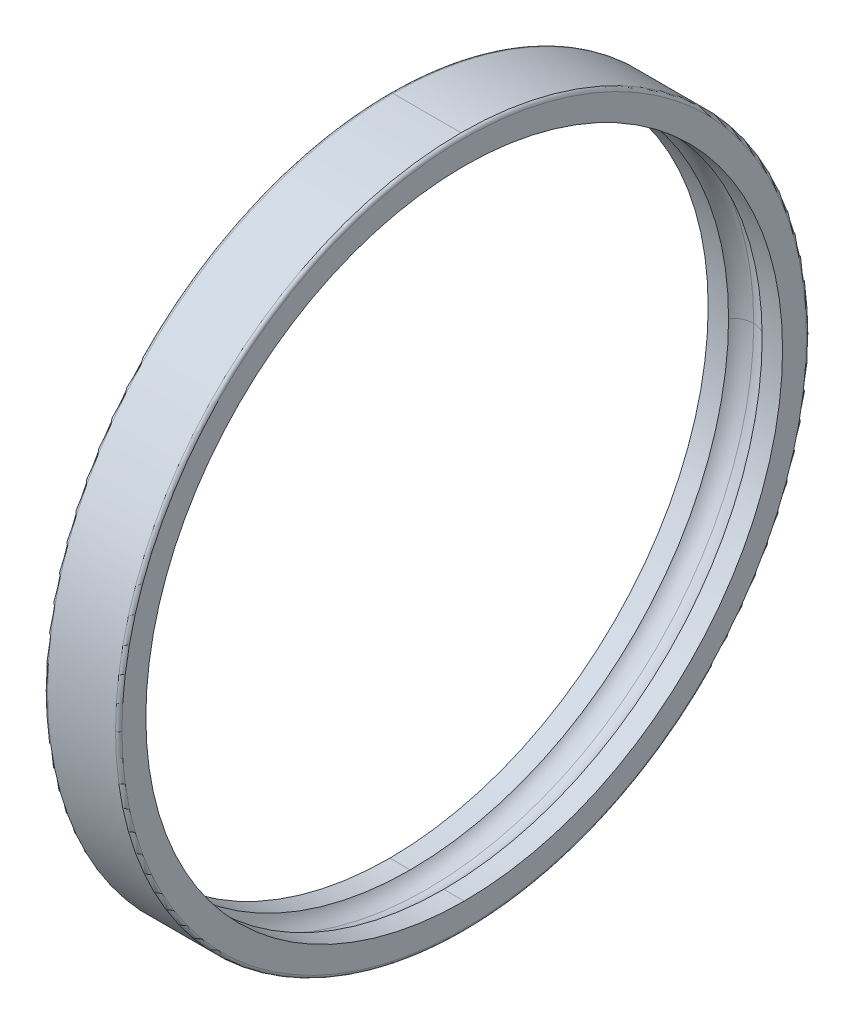
ISO-10303-21;
HEADER;
FILE_DESCRIPTION(('STEP AP214'),'2;1');
FILE_NAME('part.step','',(''),(''),'','','');
FILE_SCHEMA(('AUTOMOTIVE_DESIGN { 1 0 10303 214 1 1 1 1 }'));
ENDSEC;
DATA;
#1=APPLICATION_CONTEXT('core data for automotive mechanical design processes');
#2=APPLICATION_PROTOCOL_DEFINITION('international standard','automotive_design',2000,#1);
#3=PRODUCT_CONTEXT('',#1,'mechanical');
#4=PRODUCT('Part','Part','',(#3));
#5=PRODUCT_RELATED_PRODUCT_CATEGORY('part','',(#4));
#6=PRODUCT_DEFINITION_FORMATION('','',#4);
#7=PRODUCT_DEFINITION_CONTEXT('part definition',#1,'design');
#8=PRODUCT_DEFINITION('design','',#6,#7);
#9=PRODUCT_DEFINITION_SHAPE('','',#8);
#10=(LENGTH_UNIT() NAMED_UNIT(*) SI_UNIT(.MILLI.,.METRE.));
#11=(NAMED_UNIT(*) PLANE_ANGLE_UNIT() SI_UNIT($,.RADIAN.));
#12=(NAMED_UNIT(*) SI_UNIT($,.STERADIAN.) SOLID_ANGLE_UNIT());
#13=UNCERTAINTY_MEASURE_WITH_UNIT(LENGTH_MEASURE(1.E-05),#10,'distance_accuracy_value','');
#14=(GEOMETRIC_REPRESENTATION_CONTEXT(3) GLOBAL_UNCERTAINTY_ASSIGNED_CONTEXT((#13)) GLOBAL_UNIT_ASSIGNED_CONTEXT((#10,
#11,#12)) REPRESENTATION_CONTEXT('',''));
#15=CARTESIAN_POINT('',(0.,0.,0.));
#16=DIRECTION('',(0.,0.,1.));
#17=DIRECTION('',(1.,0.,0.));
#18=AXIS2_PLACEMENT_3D('',#15,#16,#17);
#19=CARTESIAN_POINT('',(6.04029112515579,0.,0.));
#20=DIRECTION('',(1.,0.,0.));
#21=DIRECTION('',(0.,1.,0.));
#22=AXIS2_PLACEMENT_3D('',#19,#20,#21);
#23=CYLINDRICAL_SURFACE('',#22,29.95);
#24=DIRECTION('',(1.,0.,0.));
#25=VECTOR('',#24,1.);
#26=CARTESIAN_POINT('',(6.04029112515579,29.95,0.));
#27=LINE('',#26,#25);
#28=CARTESIAN_POINT('',(5.08058225031159,29.95,0.));
#29=VERTEX_POINT('',#28);
#30=CARTESIAN_POINT('',(7.,29.95,0.));
#31=VERTEX_POINT('',#30);
#32=EDGE_CURVE('E156',#29,#31,#27,.T.);
#33=ORIENTED_EDGE('',*,*,#32,.T.);
#34=CARTESIAN_POINT('',(7.,0.,0.));
#35=DIRECTION('',(1.,0.,0.));
#36=DIRECTION('',(0.,1.,0.));
#37=AXIS2_PLACEMENT_3D('',#34,#35,#36);
#38=CIRCLE('',#37,29.95);
#39=CARTESIAN_POINT('',(7.,-29.95,0.));
#40=VERTEX_POINT('',#39);
#41=EDGE_CURVE('E11',#31,#40,#38,.T.);
#42=ORIENTED_EDGE('',*,*,#41,.T.);
#43=DIRECTION('',(-1.,0.,0.));
#44=VECTOR('',#43,1.);
#45=CARTESIAN_POINT('',(6.04029112515579,-29.95,0.));
#46=LINE('',#45,#44);
#47=CARTESIAN_POINT('',(5.08058225031159,-29.95,0.));
#48=VERTEX_POINT('',#47);
#49=EDGE_CURVE('E150',#40,#48,#46,.T.);
#50=ORIENTED_EDGE('',*,*,#49,.T.);
#51=CARTESIAN_POINT('',(5.08058225031159,0.,0.));
#52=DIRECTION('',(1.,0.,0.));
#53=DIRECTION('',(0.,1.,0.));
#54=AXIS2_PLACEMENT_3D('',#51,#52,#53);
#55=CIRCLE('',#54,29.95);
#56=CARTESIAN_POINT('',(5.08058225031159,0.,29.95));
#57=VERTEX_POINT('',#56);
#58=EDGE_CURVE('E154',#57,#48,#55,.T.);
#59=ORIENTED_EDGE('',*,*,#58,.F.);
#60=CARTESIAN_POINT('',(5.08058225031159,0.,0.));
#61=DIRECTION('',(1.,0.,0.));
#62=DIRECTION('',(0.,1.,0.));
#63=AXIS2_PLACEMENT_3D('',#60,#61,#62);
#64=CIRCLE('',#63,29.95);
#65=EDGE_CURVE('E215',#29,#57,#64,.T.);
#66=ORIENTED_EDGE('',*,*,#65,.F.);
#67=EDGE_LOOP('',(#33,#42,#50,#59,#66));
#68=FACE_BOUND('',#67,.T.);
#69=ADVANCED_FACE('F17',(#68),#23,.F.);
#70=CARTESIAN_POINT('',(7.,31.075,0.));
#71=DIRECTION('',(1.,0.,0.));
#72=DIRECTION('',(0.,-1.,0.));
#73=AXIS2_PLACEMENT_3D('',#70,#71,#72);
#74=PLANE('',#73);
#75=ORIENTED_EDGE('',*,*,#41,.F.);
#76=CARTESIAN_POINT('',(7.,0.,0.));
#77=DIRECTION('',(1.,0.,0.));
#78=DIRECTION('',(0.,1.,0.));
#79=AXIS2_PLACEMENT_3D('',#76,#77,#78);
#80=CIRCLE('',#79,29.95);
#81=EDGE_CURVE('E160',#40,#31,#80,.T.);
#82=ORIENTED_EDGE('',*,*,#81,.F.);
#83=EDGE_LOOP('',(#75,#82));
#84=FACE_BOUND('',#83,.T.);
#85=CARTESIAN_POINT('',(7.,0.,0.));
#86=DIRECTION('',(1.,0.,0.));
#87=DIRECTION('',(0.,1.,0.));
#88=AXIS2_PLACEMENT_3D('',#85,#86,#87);
#89=CIRCLE('',#88,32.2);
#90=CARTESIAN_POINT('',(7.,0.,32.2));
#91=VERTEX_POINT('',#90);
#92=CARTESIAN_POINT('',(7.,0.,-32.2));
#93=VERTEX_POINT('',#92);
#94=EDGE_CURVE('E27',#91,#93,#89,.T.);
#95=ORIENTED_EDGE('',*,*,#94,.T.);
#96=CARTESIAN_POINT('',(7.,0.,0.));
#97=DIRECTION('',(1.,0.,0.));
#98=DIRECTION('',(0.,1.,0.));
#99=AXIS2_PLACEMENT_3D('',#96,#97,#98);
#100=CIRCLE('',#99,32.2);
#101=EDGE_CURVE('E176',#93,#91,#100,.T.);
#102=ORIENTED_EDGE('',*,*,#101,.T.);
#103=EDGE_LOOP('',(#95,#102));
#104=FACE_BOUND('',#103,.T.);
#105=ADVANCED_FACE('F19',(#84,#104),#74,.T.);
#106=CARTESIAN_POINT('',(6.7,0.,0.));
#107=DIRECTION('',(1.,0.,0.));
#108=DIRECTION('',(0.,0.,-1.));
#109=AXIS2_PLACEMENT_3D('',#106,#107,#108);
#110=TOROIDAL_SURFACE('',#109,32.2,0.3);
#111=CARTESIAN_POINT('',(6.7,0.,-32.2));
#112=DIRECTION('',(0.,-1.,0.));
#113=DIRECTION('',(0.,0.,-1.));
#114=AXIS2_PLACEMENT_3D('',#111,#112,#113);
#115=CIRCLE('',#114,0.3);
#116=CARTESIAN_POINT('',(6.7,0.,-32.5));
#117=VERTEX_POINT('',#116);
#118=EDGE_CURVE('E163',#117,#93,#115,.T.);
#119=ORIENTED_EDGE('',*,*,#118,.T.);
#120=ORIENTED_EDGE('',*,*,#94,.F.);
#121=CARTESIAN_POINT('',(6.7,0.,32.2));
#122=DIRECTION('',(0.,-1.,0.));
#123=DIRECTION('',(0.,0.,1.));
#124=AXIS2_PLACEMENT_3D('',#121,#122,#123);
#125=CIRCLE('',#124,0.3);
#126=CARTESIAN_POINT('',(6.7,0.,32.5));
#127=VERTEX_POINT('',#126);
#128=EDGE_CURVE('E172',#91,#127,#125,.T.);
#129=ORIENTED_EDGE('',*,*,#128,.T.);
#130=CARTESIAN_POINT('',(6.7,0.,0.));
#131=DIRECTION('',(1.,0.,0.));
#132=DIRECTION('',(0.,1.,0.));
#133=AXIS2_PLACEMENT_3D('',#130,#131,#132);
#134=CIRCLE('',#133,32.5);
#135=CARTESIAN_POINT('',(6.7,-32.5,0.));
#136=VERTEX_POINT('',#135);
#137=EDGE_CURVE('E184',#127,#136,#134,.T.);
#138=ORIENTED_EDGE('',*,*,#137,.T.);
#139=CARTESIAN_POINT('',(6.7,0.,0.));
#140=DIRECTION('',(1.,0.,0.));
#141=DIRECTION('',(0.,1.,0.));
#142=AXIS2_PLACEMENT_3D('',#139,#140,#141);
#143=CIRCLE('',#142,32.5);
#144=EDGE_CURVE('E21',#136,#117,#143,.T.);
#145=ORIENTED_EDGE('',*,*,#144,.T.);
#146=EDGE_LOOP('',(#119,#120,#129,#138,#145));
#147=FACE_BOUND('',#146,.T.);
#148=ADVANCED_FACE('F232',(#147),#110,.T.);
#149=CARTESIAN_POINT('',(3.5,0.,0.));
#150=DIRECTION('',(1.,0.,0.));
#151=DIRECTION('',(0.,1.,0.));
#152=AXIS2_PLACEMENT_3D('',#149,#150,#151);
#153=CYLINDRICAL_SURFACE('',#152,32.5);
#154=DIRECTION('',(1.,0.,0.));
#155=VECTOR('',#154,1.);
#156=CARTESIAN_POINT('',(3.5,32.5,0.));
#157=LINE('',#156,#155);
#158=CARTESIAN_POINT('',(0.3,32.5,0.));
#159=VERTEX_POINT('',#158);
#160=CARTESIAN_POINT('',(6.7,32.5,0.));
#161=VERTEX_POINT('',#160);
#162=EDGE_CURVE('E173',#159,#161,#157,.T.);
#163=ORIENTED_EDGE('',*,*,#162,.T.);
#164=CARTESIAN_POINT('',(6.7,0.,0.));
#165=DIRECTION('',(1.,0.,0.));
#166=DIRECTION('',(0.,1.,0.));
#167=AXIS2_PLACEMENT_3D('',#164,#165,#166);
#168=CIRCLE('',#167,32.5);
#169=EDGE_CURVE('E165',#117,#161,#168,.T.);
#170=ORIENTED_EDGE('',*,*,#169,.F.);
#171=ORIENTED_EDGE('',*,*,#144,.F.);
#172=DIRECTION('',(-1.,0.,0.));
#173=VECTOR('',#172,1.);
#174=CARTESIAN_POINT('',(3.5,-32.5,0.));
#175=LINE('',#174,#173);
#176=CARTESIAN_POINT('',(0.3,-32.5,0.));
#177=VERTEX_POINT('',#176);
#178=EDGE_CURVE('E182',#136,#177,#175,.T.);
#179=ORIENTED_EDGE('',*,*,#178,.T.);
#180=CARTESIAN_POINT('',(0.3,0.,0.));
#181=DIRECTION('',(1.,0.,0.));
#182=DIRECTION('',(0.,1.,0.));
#183=AXIS2_PLACEMENT_3D('',#180,#181,#182);
#184=CIRCLE('',#183,32.5);
#185=CARTESIAN_POINT('',(0.3,0.,-32.5));
#186=VERTEX_POINT('',#185);
#187=EDGE_CURVE('E139',#177,#186,#184,.T.);
#188=ORIENTED_EDGE('',*,*,#187,.T.);
#189=CARTESIAN_POINT('',(0.3,0.,0.));
#190=DIRECTION('',(1.,0.,0.));
#191=DIRECTION('',(0.,1.,0.));
#192=AXIS2_PLACEMENT_3D('',#189,#190,#191);
#193=CIRCLE('',#192,32.5);
#194=EDGE_CURVE('E194',#186,#159,#193,.T.);
#195=ORIENTED_EDGE('',*,*,#194,.T.);
#196=EDGE_LOOP('',(#163,#170,#171,#179,#188,#195));
#197=FACE_BOUND('',#196,.T.);
#198=ADVANCED_FACE('F235',(#197),#153,.T.);
#199=CARTESIAN_POINT('',(0.3,0.,0.));
#200=DIRECTION('',(1.,0.,0.));
#201=DIRECTION('',(0.,0.,-1.));
#202=AXIS2_PLACEMENT_3D('',#199,#200,#201);
#203=TOROIDAL_SURFACE('',#202,32.2,0.3);
#204=CARTESIAN_POINT('',(0.3,0.,-32.2));
#205=DIRECTION('',(0.,-1.,0.));
#206=DIRECTION('',(0.,0.,-1.));
#207=AXIS2_PLACEMENT_3D('',#204,#205,#206);
#208=CIRCLE('',#207,0.3);
#209=CARTESIAN_POINT('',(0.,0.,-32.2));
#210=VERTEX_POINT('',#209);
#211=EDGE_CURVE('E187',#210,#186,#208,.T.);
#212=ORIENTED_EDGE('',*,*,#211,.T.);
#213=ORIENTED_EDGE('',*,*,#187,.F.);
#214=CARTESIAN_POINT('',(0.3,0.,0.));
#215=DIRECTION('',(1.,0.,0.));
#216=DIRECTION('',(0.,1.,0.));
#217=AXIS2_PLACEMENT_3D('',#214,#215,#216);
#218=CIRCLE('',#217,32.5);
#219=CARTESIAN_POINT('',(0.3,0.,32.5));
#220=VERTEX_POINT('',#219);
#221=EDGE_CURVE('E179',#220,#177,#218,.T.);
#222=ORIENTED_EDGE('',*,*,#221,.F.);
#223=CARTESIAN_POINT('',(0.3,0.,32.2));
#224=DIRECTION('',(0.,-1.,0.));
#225=DIRECTION('',(0.,0.,1.));
#226=AXIS2_PLACEMENT_3D('',#223,#224,#225);
#227=CIRCLE('',#226,0.3);
#228=CARTESIAN_POINT('',(0.,0.,32.2));
#229=VERTEX_POINT('',#228);
#230=EDGE_CURVE('E192',#220,#229,#227,.T.);
#231=ORIENTED_EDGE('',*,*,#230,.T.);
#232=CARTESIAN_POINT('',(0.,0.,0.));
#233=DIRECTION('',(1.,0.,0.));
#234=DIRECTION('',(0.,1.,0.));
#235=AXIS2_PLACEMENT_3D('',#232,#233,#234);
#236=CIRCLE('',#235,32.2);
#237=EDGE_CURVE('E138',#229,#210,#236,.T.);
#238=ORIENTED_EDGE('',*,*,#237,.T.);
#239=EDGE_LOOP('',(#212,#213,#222,#231,#238));
#240=FACE_BOUND('',#239,.T.);
#241=ADVANCED_FACE('F267',(#240),#203,.T.);
#242=CARTESIAN_POINT('',(0.,31.075,0.));
#243=DIRECTION('',(-1.,0.,0.));
#244=DIRECTION('',(0.,1.,0.));
#245=AXIS2_PLACEMENT_3D('',#242,#243,#244);
#246=PLANE('',#245);
#247=CARTESIAN_POINT('',(0.,0.,0.));
#248=DIRECTION('',(1.,0.,0.));
#249=DIRECTION('',(0.,1.,0.));
#250=AXIS2_PLACEMENT_3D('',#247,#248,#249);
#251=CIRCLE('',#250,29.95);
#252=CARTESIAN_POINT('',(0.,29.95,0.));
#253=VERTEX_POINT('',#252);
#254=CARTESIAN_POINT('',(0.,-29.95,0.));
#255=VERTEX_POINT('',#254);
#256=EDGE_CURVE('E137',#253,#255,#251,.T.);
#257=ORIENTED_EDGE('',*,*,#256,.T.);
#258=CARTESIAN_POINT('',(0.,0.,0.));
#259=DIRECTION('',(1.,0.,0.));
#260=DIRECTION('',(0.,1.,0.));
#261=AXIS2_PLACEMENT_3D('',#258,#259,#260);
#262=CIRCLE('',#261,29.95);
#263=EDGE_CURVE('E127',#255,#253,#262,.T.);
#264=ORIENTED_EDGE('',*,*,#263,.T.);
#265=EDGE_LOOP('',(#257,#264));
#266=FACE_BOUND('',#265,.T.);
#267=CARTESIAN_POINT('',(0.,0.,0.));
#268=DIRECTION('',(1.,0.,0.));
#269=DIRECTION('',(0.,1.,0.));
#270=AXIS2_PLACEMENT_3D('',#267,#268,#269);
#271=CIRCLE('',#270,32.2);
#272=EDGE_CURVE('E189',#210,#229,#271,.T.);
#273=ORIENTED_EDGE('',*,*,#272,.F.);
#274=ORIENTED_EDGE('',*,*,#237,.F.);
#275=EDGE_LOOP('',(#273,#274));
#276=FACE_BOUND('',#275,.T.);
#277=ADVANCED_FACE('F269',(#266,#276),#246,.T.);
#278=CARTESIAN_POINT('',(0.95970887484421,0.,0.));
#279=DIRECTION('',(1.,0.,0.));
#280=DIRECTION('',(0.,1.,0.));
#281=AXIS2_PLACEMENT_3D('',#278,#279,#280);
#282=CYLINDRICAL_SURFACE('',#281,29.95);
#283=DIRECTION('',(1.,0.,0.));
#284=VECTOR('',#283,1.);
#285=CARTESIAN_POINT('',(0.95970887484421,29.95,0.));
#286=LINE('',#285,#284);
#287=CARTESIAN_POINT('',(1.91941774968842,29.95,0.));
#288=VERTEX_POINT('',#287);
#289=EDGE_CURVE('E129',#253,#288,#286,.T.);
#290=ORIENTED_EDGE('',*,*,#289,.T.);
#291=CARTESIAN_POINT('',(1.91941774968842,0.,0.));
#292=DIRECTION('',(1.,0.,0.));
#293=DIRECTION('',(0.,1.,0.));
#294=AXIS2_PLACEMENT_3D('',#291,#292,#293);
#295=CIRCLE('',#294,29.95);
#296=CARTESIAN_POINT('',(1.91941774968842,0.,29.95));
#297=VERTEX_POINT('',#296);
#298=EDGE_CURVE('E35',#288,#297,#295,.T.);
#299=ORIENTED_EDGE('',*,*,#298,.T.);
#300=CARTESIAN_POINT('',(1.91941774968842,0.,0.));
#301=DIRECTION('',(1.,0.,0.));
#302=DIRECTION('',(0.,1.,0.));
#303=AXIS2_PLACEMENT_3D('',#300,#301,#302);
#304=CIRCLE('',#303,29.95);
#305=CARTESIAN_POINT('',(1.91941774968842,-29.95,0.));
#306=VERTEX_POINT('',#305);
#307=EDGE_CURVE('E103',#297,#306,#304,.T.);
#308=ORIENTED_EDGE('',*,*,#307,.T.);
#309=DIRECTION('',(-1.,0.,0.));
#310=VECTOR('',#309,1.);
#311=CARTESIAN_POINT('',(0.95970887484421,-29.95,0.));
#312=LINE('',#311,#310);
#313=EDGE_CURVE('E107',#306,#255,#312,.T.);
#314=ORIENTED_EDGE('',*,*,#313,.T.);
#315=ORIENTED_EDGE('',*,*,#256,.F.);
#316=EDGE_LOOP('',(#290,#299,#308,#314,#315));
#317=FACE_BOUND('',#316,.T.);
#318=ADVANCED_FACE('F105',(#317),#282,.F.);
#319=CARTESIAN_POINT('',(3.5,0.,0.));
#320=DIRECTION('',(1.,0.,0.));
#321=DIRECTION('',(0.,0.,-1.));
#322=AXIS2_PLACEMENT_3D('',#319,#320,#321);
#323=TOROIDAL_SURFACE('',#322,28.75,1.9845);
#324=CARTESIAN_POINT('',(3.5,0.,0.));
#325=DIRECTION('',(1.,0.,0.));
#326=DIRECTION('',(0.,0.,1.));
#327=AXIS2_PLACEMENT_3D('',#324,#325,#326);
#328=CIRCLE('',#327,30.7345);
#329=CARTESIAN_POINT('',(3.5,0.,-30.7345));
#330=VERTEX_POINT('',#329);
#331=CARTESIAN_POINT('',(3.5,0.,30.7345));
#332=VERTEX_POINT('',#331);
#333=EDGE_CURVE('E200',#330,#332,#328,.T.);
#334=ORIENTED_EDGE('',*,*,#333,.T.);
#335=CARTESIAN_POINT('',(3.5,0.,28.75));
#336=DIRECTION('',(0.,-1.,0.));
#337=DIRECTION('',(0.,0.,1.));
#338=AXIS2_PLACEMENT_3D('',#335,#336,#337);
#339=CIRCLE('',#338,1.9845);
#340=EDGE_CURVE('E111',#332,#297,#339,.T.);
#341=ORIENTED_EDGE('',*,*,#340,.T.);
#342=ORIENTED_EDGE('',*,*,#298,.F.);
#343=CARTESIAN_POINT('',(1.91941774968842,0.,0.));
#344=DIRECTION('',(1.,0.,0.));
#345=DIRECTION('',(0.,1.,0.));
#346=AXIS2_PLACEMENT_3D('',#343,#344,#345);
#347=CIRCLE('',#346,29.95);
#348=CARTESIAN_POINT('',(1.91941774968842,0.,-29.95));
#349=VERTEX_POINT('',#348);
#350=EDGE_CURVE('E122',#349,#288,#347,.T.);
#351=ORIENTED_EDGE('',*,*,#350,.F.);
#352=CARTESIAN_POINT('',(3.5,0.,-28.75));
#353=DIRECTION('',(0.,-1.,0.));
#354=DIRECTION('',(0.,0.,-1.));
#355=AXIS2_PLACEMENT_3D('',#352,#353,#354);
#356=CIRCLE('',#355,1.9845);
#357=EDGE_CURVE('E112',#349,#330,#356,.T.);
#358=ORIENTED_EDGE('',*,*,#357,.T.);
#359=EDGE_LOOP('',(#334,#341,#342,#351,#358));
#360=FACE_BOUND('',#359,.T.);
#361=ADVANCED_FACE('F197',(#360),#323,.F.);
#362=CARTESIAN_POINT('',(3.5,0.,0.));
#363=DIRECTION('',(1.,0.,0.));
#364=DIRECTION('',(0.,0.,-1.));
#365=AXIS2_PLACEMENT_3D('',#362,#363,#364);
#366=TOROIDAL_SURFACE('',#365,28.75,1.9845);
#367=CARTESIAN_POINT('',(3.5,0.,0.));
#368=DIRECTION('',(1.,0.,0.));
#369=DIRECTION('',(0.,0.,1.));
#370=AXIS2_PLACEMENT_3D('',#367,#368,#369);
#371=CIRCLE('',#370,30.7345);
#372=EDGE_CURVE('E152',#332,#330,#371,.T.);
#373=ORIENTED_EDGE('',*,*,#372,.T.);
#374=ORIENTED_EDGE('',*,*,#357,.F.);
#375=CARTESIAN_POINT('',(1.91941774968842,0.,0.));
#376=DIRECTION('',(1.,0.,0.));
#377=DIRECTION('',(0.,1.,0.));
#378=AXIS2_PLACEMENT_3D('',#375,#376,#377);
#379=CIRCLE('',#378,29.95);
#380=EDGE_CURVE('E115',#306,#349,#379,.T.);
#381=ORIENTED_EDGE('',*,*,#380,.F.);
#382=ORIENTED_EDGE('',*,*,#307,.F.);
#383=ORIENTED_EDGE('',*,*,#340,.F.);
#384=EDGE_LOOP('',(#373,#374,#381,#382,#383));
#385=FACE_BOUND('',#384,.T.);
#386=ADVANCED_FACE('F117',(#385),#366,.F.);
#387=CARTESIAN_POINT('',(0.95970887484421,0.,0.));
#388=DIRECTION('',(1.,0.,0.));
#389=DIRECTION('',(0.,1.,0.));
#390=AXIS2_PLACEMENT_3D('',#387,#388,#389);
#391=CYLINDRICAL_SURFACE('',#390,29.95);
#392=ORIENTED_EDGE('',*,*,#289,.F.);
#393=ORIENTED_EDGE('',*,*,#263,.F.);
#394=ORIENTED_EDGE('',*,*,#313,.F.);
#395=ORIENTED_EDGE('',*,*,#380,.T.);
#396=ORIENTED_EDGE('',*,*,#350,.T.);
#397=EDGE_LOOP('',(#392,#393,#394,#395,#396));
#398=FACE_BOUND('',#397,.T.);
#399=ADVANCED_FACE('F125',(#398),#391,.F.);
#400=CARTESIAN_POINT('',(0.3,0.,0.));
#401=DIRECTION('',(1.,0.,0.));
#402=DIRECTION('',(0.,0.,-1.));
#403=AXIS2_PLACEMENT_3D('',#400,#401,#402);
#404=TOROIDAL_SURFACE('',#403,32.2,0.3);
#405=ORIENTED_EDGE('',*,*,#211,.F.);
#406=ORIENTED_EDGE('',*,*,#272,.T.);
#407=ORIENTED_EDGE('',*,*,#230,.F.);
#408=CARTESIAN_POINT('',(0.3,0.,0.));
#409=DIRECTION('',(1.,0.,0.));
#410=DIRECTION('',(0.,1.,0.));
#411=AXIS2_PLACEMENT_3D('',#408,#409,#410);
#412=CIRCLE('',#411,32.5);
#413=EDGE_CURVE('E175',#159,#220,#412,.T.);
#414=ORIENTED_EDGE('',*,*,#413,.F.);
#415=ORIENTED_EDGE('',*,*,#194,.F.);
#416=EDGE_LOOP('',(#405,#406,#407,#414,#415));
#417=FACE_BOUND('',#416,.T.);
#418=ADVANCED_FACE('F285',(#417),#404,.T.);
#419=CARTESIAN_POINT('',(3.5,0.,0.));
#420=DIRECTION('',(1.,0.,0.));
#421=DIRECTION('',(0.,1.,0.));
#422=AXIS2_PLACEMENT_3D('',#419,#420,#421);
#423=CYLINDRICAL_SURFACE('',#422,32.5);
#424=ORIENTED_EDGE('',*,*,#162,.F.);
#425=ORIENTED_EDGE('',*,*,#413,.T.);
#426=ORIENTED_EDGE('',*,*,#221,.T.);
#427=ORIENTED_EDGE('',*,*,#178,.F.);
#428=ORIENTED_EDGE('',*,*,#137,.F.);
#429=CARTESIAN_POINT('',(6.7,0.,0.));
#430=DIRECTION('',(1.,0.,0.));
#431=DIRECTION('',(0.,1.,0.));
#432=AXIS2_PLACEMENT_3D('',#429,#430,#431);
#433=CIRCLE('',#432,32.5);
#434=EDGE_CURVE('E169',#161,#127,#433,.T.);
#435=ORIENTED_EDGE('',*,*,#434,.F.);
#436=EDGE_LOOP('',(#424,#425,#426,#427,#428,#435));
#437=FACE_BOUND('',#436,.T.);
#438=ADVANCED_FACE('F239',(#437),#423,.T.);
#439=CARTESIAN_POINT('',(6.7,0.,0.));
#440=DIRECTION('',(1.,0.,0.));
#441=DIRECTION('',(0.,0.,-1.));
#442=AXIS2_PLACEMENT_3D('',#439,#440,#441);
#443=TOROIDAL_SURFACE('',#442,32.2,0.3);
#444=ORIENTED_EDGE('',*,*,#118,.F.);
#445=ORIENTED_EDGE('',*,*,#169,.T.);
#446=ORIENTED_EDGE('',*,*,#434,.T.);
#447=ORIENTED_EDGE('',*,*,#128,.F.);
#448=ORIENTED_EDGE('',*,*,#101,.F.);
#449=EDGE_LOOP('',(#444,#445,#446,#447,#448));
#450=FACE_BOUND('',#449,.T.);
#451=ADVANCED_FACE('F230',(#450),#443,.T.);
#452=CARTESIAN_POINT('',(6.04029112515579,0.,0.));
#453=DIRECTION('',(1.,0.,0.));
#454=DIRECTION('',(0.,1.,0.));
#455=AXIS2_PLACEMENT_3D('',#452,#453,#454);
#456=CYLINDRICAL_SURFACE('',#455,29.95);
#457=ORIENTED_EDGE('',*,*,#32,.F.);
#458=CARTESIAN_POINT('',(5.08058225031159,0.,0.));
#459=DIRECTION('',(1.,0.,0.));
#460=DIRECTION('',(0.,1.,0.));
#461=AXIS2_PLACEMENT_3D('',#458,#459,#460);
#462=CIRCLE('',#461,29.95);
#463=CARTESIAN_POINT('',(5.08058225031159,0.,-29.95));
#464=VERTEX_POINT('',#463);
#465=EDGE_CURVE('E217',#464,#29,#462,.T.);
#466=ORIENTED_EDGE('',*,*,#465,.F.);
#467=CARTESIAN_POINT('',(5.08058225031159,0.,0.));
#468=DIRECTION('',(1.,0.,0.));
#469=DIRECTION('',(0.,1.,0.));
#470=AXIS2_PLACEMENT_3D('',#467,#468,#469);
#471=CIRCLE('',#470,29.95);
#472=EDGE_CURVE('E159',#48,#464,#471,.T.);
#473=ORIENTED_EDGE('',*,*,#472,.F.);
#474=ORIENTED_EDGE('',*,*,#49,.F.);
#475=ORIENTED_EDGE('',*,*,#81,.T.);
#476=EDGE_LOOP('',(#457,#466,#473,#474,#475));
#477=FACE_BOUND('',#476,.T.);
#478=ADVANCED_FACE('F249',(#477),#456,.F.);
#479=CARTESIAN_POINT('',(3.5,0.,0.));
#480=DIRECTION('',(1.,0.,0.));
#481=DIRECTION('',(0.,0.,-1.));
#482=AXIS2_PLACEMENT_3D('',#479,#480,#481);
#483=TOROIDAL_SURFACE('',#482,28.75,1.9845);
#484=ORIENTED_EDGE('',*,*,#372,.F.);
#485=CARTESIAN_POINT('',(3.5,0.,28.75));
#486=DIRECTION('',(0.,-1.,0.));
#487=DIRECTION('',(0.,0.,1.));
#488=AXIS2_PLACEMENT_3D('',#485,#486,#487);
#489=CIRCLE('',#488,1.9845);
#490=EDGE_CURVE('E155',#57,#332,#489,.T.);
#491=ORIENTED_EDGE('',*,*,#490,.F.);
#492=ORIENTED_EDGE('',*,*,#58,.T.);
#493=ORIENTED_EDGE('',*,*,#472,.T.);
#494=CARTESIAN_POINT('',(3.5,0.,-28.75));
#495=DIRECTION('',(0.,-1.,0.));
#496=DIRECTION('',(0.,0.,-1.));
#497=AXIS2_PLACEMENT_3D('',#494,#495,#496);
#498=CIRCLE('',#497,1.9845);
#499=EDGE_CURVE('E210',#330,#464,#498,.T.);
#500=ORIENTED_EDGE('',*,*,#499,.F.);
#501=EDGE_LOOP('',(#484,#491,#492,#493,#500));
#502=FACE_BOUND('',#501,.T.);
#503=ADVANCED_FACE('F206',(#502),#483,.F.);
#504=CARTESIAN_POINT('',(3.5,0.,0.));
#505=DIRECTION('',(1.,0.,0.));
#506=DIRECTION('',(0.,0.,-1.));
#507=AXIS2_PLACEMENT_3D('',#504,#505,#506);
#508=TOROIDAL_SURFACE('',#507,28.75,1.9845);
#509=ORIENTED_EDGE('',*,*,#333,.F.);
#510=ORIENTED_EDGE('',*,*,#499,.T.);
#511=ORIENTED_EDGE('',*,*,#465,.T.);
#512=ORIENTED_EDGE('',*,*,#65,.T.);
#513=ORIENTED_EDGE('',*,*,#490,.T.);
#514=EDGE_LOOP('',(#509,#510,#511,#512,#513));
#515=FACE_BOUND('',#514,.T.);
#516=ADVANCED_FACE('F212',(#515),#508,.F.);
#517=CLOSED_SHELL('',(#69,#105,#148,#198,#241,#277,#318,#361,#386,#399,#418,#438,#451,#478,#503,#516));
#518=MANIFOLD_SOLID_BREP('B1',#517);
#519=ADVANCED_BREP_SHAPE_REPRESENTATION('',(#18,#518),#14);
#520=SHAPE_DEFINITION_REPRESENTATION(#9,#519);
ENDSEC;
END-ISO-10303-21;
